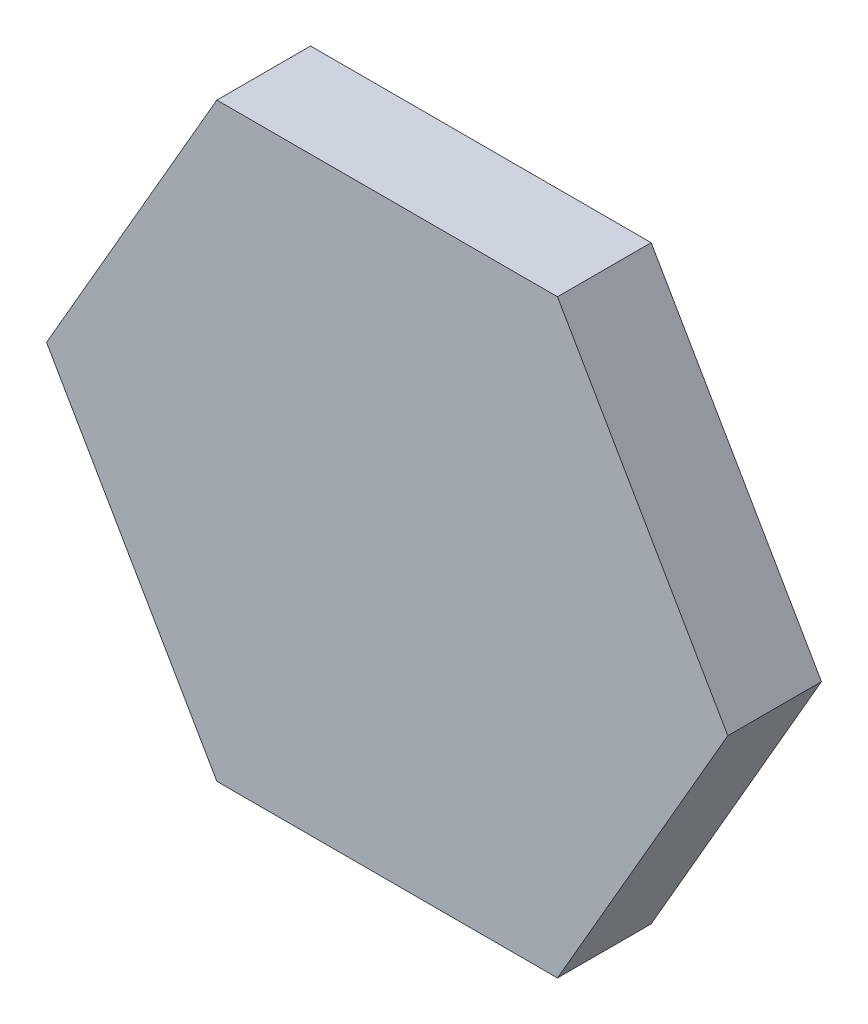
ISO-10303-21;
HEADER;
FILE_DESCRIPTION(('STEP AP214'),'2;1');
FILE_NAME('part.step','',(''),(''),'','','');
FILE_SCHEMA(('AUTOMOTIVE_DESIGN { 1 0 10303 214 1 1 1 1 }'));
ENDSEC;
DATA;
#1=APPLICATION_CONTEXT('core data for automotive mechanical design processes');
#2=APPLICATION_PROTOCOL_DEFINITION('international standard','automotive_design',2000,#1);
#3=PRODUCT_CONTEXT('',#1,'mechanical');
#4=PRODUCT('Part','Part','',(#3));
#5=PRODUCT_RELATED_PRODUCT_CATEGORY('part','',(#4));
#6=PRODUCT_DEFINITION_FORMATION('','',#4);
#7=PRODUCT_DEFINITION_CONTEXT('part definition',#1,'design');
#8=PRODUCT_DEFINITION('design','',#6,#7);
#9=PRODUCT_DEFINITION_SHAPE('','',#8);
#10=(LENGTH_UNIT() NAMED_UNIT(*) SI_UNIT(.MILLI.,.METRE.));
#11=(NAMED_UNIT(*) PLANE_ANGLE_UNIT() SI_UNIT($,.RADIAN.));
#12=(NAMED_UNIT(*) SI_UNIT($,.STERADIAN.) SOLID_ANGLE_UNIT());
#13=UNCERTAINTY_MEASURE_WITH_UNIT(LENGTH_MEASURE(1.E-05),#10,'distance_accuracy_value','');
#14=(GEOMETRIC_REPRESENTATION_CONTEXT(3) GLOBAL_UNCERTAINTY_ASSIGNED_CONTEXT((#13)) GLOBAL_UNIT_ASSIGNED_CONTEXT((#10,
#11,#12)) REPRESENTATION_CONTEXT('',''));
#15=CARTESIAN_POINT('',(0.,0.,0.));
#16=DIRECTION('',(0.,0.,1.));
#17=DIRECTION('',(1.,0.,0.));
#18=AXIS2_PLACEMENT_3D('',#15,#16,#17);
#19=CARTESIAN_POINT('',(-60.,0.,1.5));
#20=DIRECTION('',(0.866025403784439,0.5,0.));
#21=DIRECTION('',(-0.5,0.866025403784439,0.));
#22=AXIS2_PLACEMENT_3D('',#19,#20,#21);
#23=PLANE('',#22);
#24=DIRECTION('',(0.,0.,-1.));
#25=VECTOR('',#24,1.);
#26=CARTESIAN_POINT('',(-60.,0.,1.5));
#27=LINE('',#26,#25);
#28=CARTESIAN_POINT('',(-60.,0.,1.5));
#29=VERTEX_POINT('',#28);
#30=CARTESIAN_POINT('',(-60.,0.,-15.));
#31=VERTEX_POINT('',#30);
#32=EDGE_CURVE('E270',#29,#31,#27,.T.);
#33=ORIENTED_EDGE('',*,*,#32,.T.);
#34=DIRECTION('',(0.5,-0.866025403784439,0.));
#35=VECTOR('',#34,1.);
#36=CARTESIAN_POINT('',(-60.,0.,-15.));
#37=LINE('',#36,#35);
#38=CARTESIAN_POINT('',(-30.,-51.9615242270663,-15.));
#39=VERTEX_POINT('',#38);
#40=EDGE_CURVE('E249',#31,#39,#37,.T.);
#41=ORIENTED_EDGE('',*,*,#40,.T.);
#42=DIRECTION('',(0.,0.,-1.));
#43=VECTOR('',#42,1.);
#44=CARTESIAN_POINT('',(-30.,-51.9615242270663,1.5));
#45=LINE('',#44,#43);
#46=CARTESIAN_POINT('',(-30.,-51.9615242270663,1.5));
#47=VERTEX_POINT('',#46);
#48=EDGE_CURVE('E280',#47,#39,#45,.T.);
#49=ORIENTED_EDGE('',*,*,#48,.F.);
#50=DIRECTION('',(0.5,-0.866025403784438,0.));
#51=VECTOR('',#50,1.);
#52=CARTESIAN_POINT('',(-60.,0.,1.5));
#53=LINE('',#52,#51);
#54=EDGE_CURVE('E255',#29,#47,#53,.T.);
#55=ORIENTED_EDGE('',*,*,#54,.F.);
#56=EDGE_LOOP('',(#33,#41,#49,#55));
#57=FACE_BOUND('',#56,.T.);
#58=ADVANCED_FACE('F33',(#57),#23,.F.);
#59=CARTESIAN_POINT('',(-30.,-51.9615242270663,1.5));
#60=DIRECTION('',(0.,1.,0.));
#61=DIRECTION('',(0.,0.,1.));
#62=AXIS2_PLACEMENT_3D('',#59,#60,#61);
#63=PLANE('',#62);
#64=ORIENTED_EDGE('',*,*,#48,.T.);
#65=DIRECTION('',(1.,0.,0.));
#66=VECTOR('',#65,1.);
#67=CARTESIAN_POINT('',(30.,-51.9615242270663,-15.));
#68=LINE('',#67,#66);
#69=CARTESIAN_POINT('',(30.,-51.9615242270663,-15.));
#70=VERTEX_POINT('',#69);
#71=EDGE_CURVE('E244',#39,#70,#68,.T.);
#72=ORIENTED_EDGE('',*,*,#71,.T.);
#73=DIRECTION('',(0.,0.,-1.));
#74=VECTOR('',#73,1.);
#75=CARTESIAN_POINT('',(30.,-51.9615242270663,1.5));
#76=LINE('',#75,#74);
#77=CARTESIAN_POINT('',(30.,-51.9615242270663,1.5));
#78=VERTEX_POINT('',#77);
#79=EDGE_CURVE('E278',#78,#70,#76,.T.);
#80=ORIENTED_EDGE('',*,*,#79,.F.);
#81=DIRECTION('',(1.,0.,0.));
#82=VECTOR('',#81,1.);
#83=CARTESIAN_POINT('',(-30.,-51.9615242270663,1.5));
#84=LINE('',#83,#82);
#85=EDGE_CURVE('E260',#47,#78,#84,.T.);
#86=ORIENTED_EDGE('',*,*,#85,.F.);
#87=EDGE_LOOP('',(#64,#72,#80,#86));
#88=FACE_BOUND('',#87,.T.);
#89=ADVANCED_FACE('F328',(#88),#63,.F.);
#90=CARTESIAN_POINT('',(30.,-51.9615242270663,1.5));
#91=DIRECTION('',(-0.866025403784439,0.5,0.));
#92=DIRECTION('',(-0.5,-0.866025403784439,0.));
#93=AXIS2_PLACEMENT_3D('',#90,#91,#92);
#94=PLANE('',#93);
#95=ORIENTED_EDGE('',*,*,#79,.T.);
#96=DIRECTION('',(0.5,0.866025403784439,0.));
#97=VECTOR('',#96,1.);
#98=CARTESIAN_POINT('',(60.,0.,-15.));
#99=LINE('',#98,#97);
#100=CARTESIAN_POINT('',(60.,0.,-15.));
#101=VERTEX_POINT('',#100);
#102=EDGE_CURVE('E238',#70,#101,#99,.T.);
#103=ORIENTED_EDGE('',*,*,#102,.T.);
#104=DIRECTION('',(0.,0.,-1.));
#105=VECTOR('',#104,1.);
#106=CARTESIAN_POINT('',(60.,0.,1.5));
#107=LINE('',#106,#105);
#108=CARTESIAN_POINT('',(60.,0.,1.5));
#109=VERTEX_POINT('',#108);
#110=EDGE_CURVE('E276',#109,#101,#107,.T.);
#111=ORIENTED_EDGE('',*,*,#110,.F.);
#112=DIRECTION('',(0.5,0.866025403784439,0.));
#113=VECTOR('',#112,1.);
#114=CARTESIAN_POINT('',(30.,-51.9615242270663,1.5));
#115=LINE('',#114,#113);
#116=EDGE_CURVE('E262',#78,#109,#115,.T.);
#117=ORIENTED_EDGE('',*,*,#116,.F.);
#118=EDGE_LOOP('',(#95,#103,#111,#117));
#119=FACE_BOUND('',#118,.T.);
#120=ADVANCED_FACE('F334',(#119),#94,.F.);
#121=CARTESIAN_POINT('',(60.,0.,1.5));
#122=DIRECTION('',(-0.866025403784438,-0.5,0.));
#123=DIRECTION('',(0.5,-0.866025403784439,0.));
#124=AXIS2_PLACEMENT_3D('',#121,#122,#123);
#125=PLANE('',#124);
#126=ORIENTED_EDGE('',*,*,#110,.T.);
#127=DIRECTION('',(0.5,-0.866025403784439,0.));
#128=VECTOR('',#127,1.);
#129=CARTESIAN_POINT('',(60.,0.,-15.));
#130=LINE('',#129,#128);
#131=CARTESIAN_POINT('',(30.,51.9615242270663,-15.));
#132=VERTEX_POINT('',#131);
#133=EDGE_CURVE('E221',#132,#101,#130,.T.);
#134=ORIENTED_EDGE('',*,*,#133,.F.);
#135=DIRECTION('',(0.,0.,-1.));
#136=VECTOR('',#135,1.);
#137=CARTESIAN_POINT('',(30.,51.9615242270663,1.5));
#138=LINE('',#137,#136);
#139=CARTESIAN_POINT('',(30.,51.9615242270663,1.5));
#140=VERTEX_POINT('',#139);
#141=EDGE_CURVE('E274',#140,#132,#138,.T.);
#142=ORIENTED_EDGE('',*,*,#141,.F.);
#143=DIRECTION('',(-0.5,0.866025403784439,0.));
#144=VECTOR('',#143,1.);
#145=CARTESIAN_POINT('',(60.,0.,1.5));
#146=LINE('',#145,#144);
#147=EDGE_CURVE('E264',#109,#140,#146,.T.);
#148=ORIENTED_EDGE('',*,*,#147,.F.);
#149=EDGE_LOOP('',(#126,#134,#142,#148));
#150=FACE_BOUND('',#149,.T.);
#151=ADVANCED_FACE('F356',(#150),#125,.F.);
#152=CARTESIAN_POINT('',(30.,51.9615242270663,1.5));
#153=DIRECTION('',(0.,-1.,0.));
#154=DIRECTION('',(0.,0.,-1.));
#155=AXIS2_PLACEMENT_3D('',#152,#153,#154);
#156=PLANE('',#155);
#157=ORIENTED_EDGE('',*,*,#141,.T.);
#158=DIRECTION('',(1.,0.,0.));
#159=VECTOR('',#158,1.);
#160=CARTESIAN_POINT('',(30.,51.9615242270663,-15.));
#161=LINE('',#160,#159);
#162=CARTESIAN_POINT('',(-30.,51.9615242270663,-15.));
#163=VERTEX_POINT('',#162);
#164=EDGE_CURVE('E229',#163,#132,#161,.T.);
#165=ORIENTED_EDGE('',*,*,#164,.F.);
#166=DIRECTION('',(0.,0.,-1.));
#167=VECTOR('',#166,1.);
#168=CARTESIAN_POINT('',(-30.,51.9615242270663,1.5));
#169=LINE('',#168,#167);
#170=CARTESIAN_POINT('',(-30.,51.9615242270663,1.5));
#171=VERTEX_POINT('',#170);
#172=EDGE_CURVE('E272',#171,#163,#169,.T.);
#173=ORIENTED_EDGE('',*,*,#172,.F.);
#174=DIRECTION('',(-1.,0.,0.));
#175=VECTOR('',#174,1.);
#176=CARTESIAN_POINT('',(30.,51.9615242270663,1.5));
#177=LINE('',#176,#175);
#178=EDGE_CURVE('E266',#140,#171,#177,.T.);
#179=ORIENTED_EDGE('',*,*,#178,.F.);
#180=EDGE_LOOP('',(#157,#165,#173,#179));
#181=FACE_BOUND('',#180,.T.);
#182=ADVANCED_FACE('F352',(#181),#156,.F.);
#183=CARTESIAN_POINT('',(-30.,51.9615242270663,1.5));
#184=DIRECTION('',(0.866025403784439,-0.5,0.));
#185=DIRECTION('',(0.5,0.866025403784439,0.));
#186=AXIS2_PLACEMENT_3D('',#183,#184,#185);
#187=PLANE('',#186);
#188=ORIENTED_EDGE('',*,*,#172,.T.);
#189=DIRECTION('',(0.5,0.866025403784439,0.));
#190=VECTOR('',#189,1.);
#191=CARTESIAN_POINT('',(-60.,0.,-15.));
#192=LINE('',#191,#190);
#193=EDGE_CURVE('E233',#31,#163,#192,.T.);
#194=ORIENTED_EDGE('',*,*,#193,.F.);
#195=ORIENTED_EDGE('',*,*,#32,.F.);
#196=DIRECTION('',(-0.5,-0.866025403784439,0.));
#197=VECTOR('',#196,1.);
#198=CARTESIAN_POINT('',(-30.,51.9615242270663,1.5));
#199=LINE('',#198,#197);
#200=EDGE_CURVE('E268',#171,#29,#199,.T.);
#201=ORIENTED_EDGE('',*,*,#200,.F.);
#202=EDGE_LOOP('',(#188,#194,#195,#201));
#203=FACE_BOUND('',#202,.T.);
#204=ADVANCED_FACE('F348',(#203),#187,.F.);
#205=CARTESIAN_POINT('',(0.,0.,1.5));
#206=DIRECTION('',(0.,0.,1.));
#207=DIRECTION('',(1.,0.,0.));
#208=AXIS2_PLACEMENT_3D('',#205,#206,#207);
#209=PLANE('',#208);
#210=ORIENTED_EDGE('',*,*,#54,.T.);
#211=ORIENTED_EDGE('',*,*,#85,.T.);
#212=ORIENTED_EDGE('',*,*,#116,.T.);
#213=ORIENTED_EDGE('',*,*,#147,.T.);
#214=ORIENTED_EDGE('',*,*,#178,.T.);
#215=ORIENTED_EDGE('',*,*,#200,.T.);
#216=EDGE_LOOP('',(#210,#211,#212,#213,#214,#215));
#217=FACE_BOUND('',#216,.T.);
#218=ADVANCED_FACE('F363',(#217),#209,.T.);
#219=CARTESIAN_POINT('',(-58.7009618943234,0.749999999999979,-15.));
#220=DIRECTION('',(0.,0.,-1.));
#221=DIRECTION('',(0.,1.,0.));
#222=AXIS2_PLACEMENT_3D('',#219,#220,#221);
#223=PLANE('',#222);
#224=DIRECTION('',(0.5,-0.866025403784438,0.));
#225=VECTOR('',#224,1.);
#226=CARTESIAN_POINT('',(29.75,51.5285115251741,-15.));
#227=LINE('',#226,#225);
#228=CARTESIAN_POINT('',(29.75,51.5285115251741,-15.));
#229=VERTEX_POINT('',#228);
#230=CARTESIAN_POINT('',(59.5,0.,-15.));
#231=VERTEX_POINT('',#230);
#232=EDGE_CURVE('E47',#229,#231,#227,.T.);
#233=ORIENTED_EDGE('',*,*,#232,.F.);
#234=DIRECTION('',(1.,0.,0.));
#235=VECTOR('',#234,1.);
#236=CARTESIAN_POINT('',(-29.75,51.5285115251741,-15.));
#237=LINE('',#236,#235);
#238=CARTESIAN_POINT('',(-29.75,51.5285115251741,-15.));
#239=VERTEX_POINT('',#238);
#240=EDGE_CURVE('E177',#239,#229,#237,.T.);
#241=ORIENTED_EDGE('',*,*,#240,.F.);
#242=DIRECTION('',(0.499999999999999,0.866025403784439,0.));
#243=VECTOR('',#242,1.);
#244=CARTESIAN_POINT('',(-59.5,0.,-15.));
#245=LINE('',#244,#243);
#246=CARTESIAN_POINT('',(-59.5,0.,-15.));
#247=VERTEX_POINT('',#246);
#248=EDGE_CURVE('E180',#247,#239,#245,.T.);
#249=ORIENTED_EDGE('',*,*,#248,.F.);
#250=DIRECTION('',(-0.5,0.866025403784438,0.));
#251=VECTOR('',#250,1.);
#252=CARTESIAN_POINT('',(-29.75,-51.5285115251741,-15.));
#253=LINE('',#252,#251);
#254=CARTESIAN_POINT('',(-29.75,-51.5285115251741,-15.));
#255=VERTEX_POINT('',#254);
#256=EDGE_CURVE('E196',#255,#247,#253,.T.);
#257=ORIENTED_EDGE('',*,*,#256,.F.);
#258=DIRECTION('',(-1.,0.,0.));
#259=VECTOR('',#258,1.);
#260=CARTESIAN_POINT('',(29.75,-51.5285115251741,-15.));
#261=LINE('',#260,#259);
#262=CARTESIAN_POINT('',(29.75,-51.5285115251741,-15.));
#263=VERTEX_POINT('',#262);
#264=EDGE_CURVE('E193',#263,#255,#261,.T.);
#265=ORIENTED_EDGE('',*,*,#264,.F.);
#266=DIRECTION('',(-0.499999999999999,-0.866025403784439,0.));
#267=VECTOR('',#266,1.);
#268=CARTESIAN_POINT('',(59.5,0.,-15.));
#269=LINE('',#268,#267);
#270=EDGE_CURVE('E191',#231,#263,#269,.T.);
#271=ORIENTED_EDGE('',*,*,#270,.F.);
#272=EDGE_LOOP('',(#233,#241,#249,#257,#265,#271));
#273=FACE_BOUND('',#272,.T.);
#274=ORIENTED_EDGE('',*,*,#133,.T.);
#275=ORIENTED_EDGE('',*,*,#102,.F.);
#276=ORIENTED_EDGE('',*,*,#71,.F.);
#277=ORIENTED_EDGE('',*,*,#40,.F.);
#278=ORIENTED_EDGE('',*,*,#193,.T.);
#279=ORIENTED_EDGE('',*,*,#164,.T.);
#280=EDGE_LOOP('',(#274,#275,#276,#277,#278,#279));
#281=FACE_BOUND('',#280,.T.);
#282=ADVANCED_FACE('F345',(#273,#281),#223,.T.);
#283=CARTESIAN_POINT('',(0.,0.,-14.));
#284=DIRECTION('',(0.,0.,-1.));
#285=DIRECTION('',(0.,1.,0.));
#286=AXIS2_PLACEMENT_3D('',#283,#284,#285);
#287=PLANE('',#286);
#288=DIRECTION('',(0.5,-0.866025403784438,0.));
#289=VECTOR('',#288,1.);
#290=CARTESIAN_POINT('',(29.75,51.5285115251741,-14.));
#291=LINE('',#290,#289);
#292=CARTESIAN_POINT('',(29.75,51.5285115251741,-14.));
#293=VERTEX_POINT('',#292);
#294=CARTESIAN_POINT('',(59.5,0.,-14.));
#295=VERTEX_POINT('',#294);
#296=EDGE_CURVE('E158',#293,#295,#291,.T.);
#297=ORIENTED_EDGE('',*,*,#296,.T.);
#298=DIRECTION('',(-0.499999999999999,-0.866025403784439,0.));
#299=VECTOR('',#298,1.);
#300=CARTESIAN_POINT('',(59.5,0.,-14.));
#301=LINE('',#300,#299);
#302=CARTESIAN_POINT('',(29.75,-51.5285115251741,-14.));
#303=VERTEX_POINT('',#302);
#304=EDGE_CURVE('E167',#295,#303,#301,.T.);
#305=ORIENTED_EDGE('',*,*,#304,.T.);
#306=DIRECTION('',(-1.,0.,0.));
#307=VECTOR('',#306,1.);
#308=CARTESIAN_POINT('',(29.75,-51.5285115251741,-14.));
#309=LINE('',#308,#307);
#310=CARTESIAN_POINT('',(-29.75,-51.5285115251741,-14.));
#311=VERTEX_POINT('',#310);
#312=EDGE_CURVE('E172',#303,#311,#309,.T.);
#313=ORIENTED_EDGE('',*,*,#312,.T.);
#314=DIRECTION('',(-0.5,0.866025403784438,0.));
#315=VECTOR('',#314,1.);
#316=CARTESIAN_POINT('',(-29.75,-51.5285115251741,-14.));
#317=LINE('',#316,#315);
#318=CARTESIAN_POINT('',(-59.5,0.,-14.));
#319=VERTEX_POINT('',#318);
#320=EDGE_CURVE('E184',#311,#319,#317,.T.);
#321=ORIENTED_EDGE('',*,*,#320,.T.);
#322=DIRECTION('',(0.499999999999999,0.866025403784439,0.));
#323=VECTOR('',#322,1.);
#324=CARTESIAN_POINT('',(-59.5,0.,-14.));
#325=LINE('',#324,#323);
#326=CARTESIAN_POINT('',(-29.75,51.5285115251741,-14.));
#327=VERTEX_POINT('',#326);
#328=EDGE_CURVE('E187',#319,#327,#325,.T.);
#329=ORIENTED_EDGE('',*,*,#328,.T.);
#330=DIRECTION('',(1.,0.,0.));
#331=VECTOR('',#330,1.);
#332=CARTESIAN_POINT('',(-29.75,51.5285115251741,-14.));
#333=LINE('',#332,#331);
#334=EDGE_CURVE('E164',#327,#293,#333,.T.);
#335=ORIENTED_EDGE('',*,*,#334,.T.);
#336=EDGE_LOOP('',(#297,#305,#313,#321,#329,#335));
#337=FACE_BOUND('',#336,.T.);
#338=DIRECTION('',(0.5,-0.866025403784438,0.));
#339=VECTOR('',#338,1.);
#340=CARTESIAN_POINT('',(-43.7009618943234,-25.2307621135332,-14.));
#341=LINE('',#340,#339);
#342=CARTESIAN_POINT('',(-58.2679491924312,0.,-14.));
#343=VERTEX_POINT('',#342);
#344=CARTESIAN_POINT('',(-29.1339745962156,-50.4615242270663,-14.));
#345=VERTEX_POINT('',#344);
#346=EDGE_CURVE('E219',#343,#345,#341,.T.);
#347=ORIENTED_EDGE('',*,*,#346,.T.);
#348=DIRECTION('',(-1.,0.,0.));
#349=VECTOR('',#348,1.);
#350=CARTESIAN_POINT('',(0.,-50.4615242270663,-14.));
#351=LINE('',#350,#349);
#352=CARTESIAN_POINT('',(29.1339745962156,-50.4615242270663,-14.));
#353=VERTEX_POINT('',#352);
#354=EDGE_CURVE('E216',#353,#345,#351,.T.);
#355=ORIENTED_EDGE('',*,*,#354,.F.);
#356=DIRECTION('',(-0.5,-0.866025403784439,0.));
#357=VECTOR('',#356,1.);
#358=CARTESIAN_POINT('',(43.7009618943234,-25.2307621135331,-14.));
#359=LINE('',#358,#357);
#360=CARTESIAN_POINT('',(58.2679491924311,0.,-14.));
#361=VERTEX_POINT('',#360);
#362=EDGE_CURVE('E55',#361,#353,#359,.T.);
#363=ORIENTED_EDGE('',*,*,#362,.F.);
#364=DIRECTION('',(0.5,-0.866025403784439,0.));
#365=VECTOR('',#364,1.);
#366=CARTESIAN_POINT('',(43.7009618943234,25.2307621135331,-14.));
#367=LINE('',#366,#365);
#368=CARTESIAN_POINT('',(29.1339745962156,50.4615242270663,-14.));
#369=VERTEX_POINT('',#368);
#370=EDGE_CURVE('E11',#369,#361,#367,.T.);
#371=ORIENTED_EDGE('',*,*,#370,.F.);
#372=DIRECTION('',(1.,0.,0.));
#373=VECTOR('',#372,1.);
#374=CARTESIAN_POINT('',(0.,50.4615242270663,-14.));
#375=LINE('',#374,#373);
#376=CARTESIAN_POINT('',(-29.1339745962156,50.4615242270663,-14.));
#377=VERTEX_POINT('',#376);
#378=EDGE_CURVE('E203',#377,#369,#375,.T.);
#379=ORIENTED_EDGE('',*,*,#378,.F.);
#380=DIRECTION('',(-0.5,-0.866025403784438,0.));
#381=VECTOR('',#380,1.);
#382=CARTESIAN_POINT('',(-43.7009618943234,25.2307621135332,-14.));
#383=LINE('',#382,#381);
#384=EDGE_CURVE('E213',#377,#343,#383,.T.);
#385=ORIENTED_EDGE('',*,*,#384,.T.);
#386=EDGE_LOOP('',(#347,#355,#363,#371,#379,#385));
#387=FACE_BOUND('',#386,.T.);
#388=ADVANCED_FACE('F174',(#337,#387),#287,.T.);
#389=CARTESIAN_POINT('',(29.75,51.5285115251741,-14.));
#390=DIRECTION('',(0.866025403784438,0.5,0.));
#391=DIRECTION('',(-0.5,0.866025403784439,0.));
#392=AXIS2_PLACEMENT_3D('',#389,#390,#391);
#393=PLANE('',#392);
#394=ORIENTED_EDGE('',*,*,#232,.T.);
#395=DIRECTION('',(0.,0.,-1.));
#396=VECTOR('',#395,1.);
#397=CARTESIAN_POINT('',(59.5,0.,-14.));
#398=LINE('',#397,#396);
#399=EDGE_CURVE('E154',#295,#231,#398,.T.);
#400=ORIENTED_EDGE('',*,*,#399,.F.);
#401=ORIENTED_EDGE('',*,*,#296,.F.);
#402=DIRECTION('',(0.,0.,-1.));
#403=VECTOR('',#402,1.);
#404=CARTESIAN_POINT('',(29.75,51.5285115251741,-14.));
#405=LINE('',#404,#403);
#406=EDGE_CURVE('E201',#293,#229,#405,.T.);
#407=ORIENTED_EDGE('',*,*,#406,.T.);
#408=EDGE_LOOP('',(#394,#400,#401,#407));
#409=FACE_BOUND('',#408,.T.);
#410=ADVANCED_FACE('F156',(#409),#393,.F.);
#411=CARTESIAN_POINT('',(-29.75,51.5285115251741,-14.));
#412=DIRECTION('',(0.,1.,0.));
#413=DIRECTION('',(-1.,0.,0.));
#414=AXIS2_PLACEMENT_3D('',#411,#412,#413);
#415=PLANE('',#414);
#416=ORIENTED_EDGE('',*,*,#240,.T.);
#417=ORIENTED_EDGE('',*,*,#406,.F.);
#418=ORIENTED_EDGE('',*,*,#334,.F.);
#419=DIRECTION('',(0.,0.,-1.));
#420=VECTOR('',#419,1.);
#421=CARTESIAN_POINT('',(-29.75,51.5285115251741,-14.));
#422=LINE('',#421,#420);
#423=EDGE_CURVE('E204',#327,#239,#422,.T.);
#424=ORIENTED_EDGE('',*,*,#423,.T.);
#425=EDGE_LOOP('',(#416,#417,#418,#424));
#426=FACE_BOUND('',#425,.T.);
#427=ADVANCED_FACE('F424',(#426),#415,.F.);
#428=CARTESIAN_POINT('',(-59.5,0.,-14.));
#429=DIRECTION('',(-0.866025403784439,0.499999999999999,0.));
#430=DIRECTION('',(-0.499999999999999,-0.866025403784439,0.));
#431=AXIS2_PLACEMENT_3D('',#428,#429,#430);
#432=PLANE('',#431);
#433=ORIENTED_EDGE('',*,*,#248,.T.);
#434=ORIENTED_EDGE('',*,*,#423,.F.);
#435=ORIENTED_EDGE('',*,*,#328,.F.);
#436=DIRECTION('',(0.,0.,-1.));
#437=VECTOR('',#436,1.);
#438=CARTESIAN_POINT('',(-59.5,0.,-14.));
#439=LINE('',#438,#437);
#440=EDGE_CURVE('E206',#319,#247,#439,.T.);
#441=ORIENTED_EDGE('',*,*,#440,.T.);
#442=EDGE_LOOP('',(#433,#434,#435,#441));
#443=FACE_BOUND('',#442,.T.);
#444=ADVANCED_FACE('F433',(#443),#432,.F.);
#445=CARTESIAN_POINT('',(-29.75,-51.5285115251741,-14.));
#446=DIRECTION('',(-0.866025403784438,-0.5,0.));
#447=DIRECTION('',(0.5,-0.866025403784439,0.));
#448=AXIS2_PLACEMENT_3D('',#445,#446,#447);
#449=PLANE('',#448);
#450=ORIENTED_EDGE('',*,*,#256,.T.);
#451=ORIENTED_EDGE('',*,*,#440,.F.);
#452=ORIENTED_EDGE('',*,*,#320,.F.);
#453=DIRECTION('',(0.,0.,-1.));
#454=VECTOR('',#453,1.);
#455=CARTESIAN_POINT('',(-29.75,-51.5285115251741,-14.));
#456=LINE('',#455,#454);
#457=EDGE_CURVE('E208',#311,#255,#456,.T.);
#458=ORIENTED_EDGE('',*,*,#457,.T.);
#459=EDGE_LOOP('',(#450,#451,#452,#458));
#460=FACE_BOUND('',#459,.T.);
#461=ADVANCED_FACE('F443',(#460),#449,.F.);
#462=CARTESIAN_POINT('',(29.75,-51.5285115251741,-14.));
#463=DIRECTION('',(0.,-1.,0.));
#464=DIRECTION('',(1.,0.,0.));
#465=AXIS2_PLACEMENT_3D('',#462,#463,#464);
#466=PLANE('',#465);
#467=ORIENTED_EDGE('',*,*,#264,.T.);
#468=ORIENTED_EDGE('',*,*,#457,.F.);
#469=ORIENTED_EDGE('',*,*,#312,.F.);
#470=DIRECTION('',(0.,0.,-1.));
#471=VECTOR('',#470,1.);
#472=CARTESIAN_POINT('',(29.75,-51.5285115251741,-14.));
#473=LINE('',#472,#471);
#474=EDGE_CURVE('E163',#303,#263,#473,.T.);
#475=ORIENTED_EDGE('',*,*,#474,.T.);
#476=EDGE_LOOP('',(#467,#468,#469,#475));
#477=FACE_BOUND('',#476,.T.);
#478=ADVANCED_FACE('F453',(#477),#466,.F.);
#479=CARTESIAN_POINT('',(59.5,0.,-14.));
#480=DIRECTION('',(0.866025403784439,-0.5,0.));
#481=DIRECTION('',(0.499999999999999,0.866025403784439,0.));
#482=AXIS2_PLACEMENT_3D('',#479,#480,#481);
#483=PLANE('',#482);
#484=ORIENTED_EDGE('',*,*,#270,.T.);
#485=ORIENTED_EDGE('',*,*,#474,.F.);
#486=ORIENTED_EDGE('',*,*,#304,.F.);
#487=ORIENTED_EDGE('',*,*,#399,.T.);
#488=EDGE_LOOP('',(#484,#485,#486,#487));
#489=FACE_BOUND('',#488,.T.);
#490=ADVANCED_FACE('F168',(#489),#483,.F.);
#491=CARTESIAN_POINT('',(0.,0.,0.));
#492=DIRECTION('',(0.,0.,1.));
#493=DIRECTION('',(1.,0.,0.));
#494=AXIS2_PLACEMENT_3D('',#491,#492,#493);
#495=PLANE('',#494);
#496=DIRECTION('',(-1.,0.,0.));
#497=VECTOR('',#496,1.);
#498=CARTESIAN_POINT('',(-30.,50.4615242270663,0.));
#499=LINE('',#498,#497);
#500=CARTESIAN_POINT('',(29.1339745962156,50.4615242270663,0.));
#501=VERTEX_POINT('',#500);
#502=CARTESIAN_POINT('',(-29.1339745962156,50.4615242270663,0.));
#503=VERTEX_POINT('',#502);
#504=EDGE_CURVE('E230',#501,#503,#499,.T.);
#505=ORIENTED_EDGE('',*,*,#504,.F.);
#506=DIRECTION('',(-0.5,0.866025403784439,0.));
#507=VECTOR('',#506,1.);
#508=CARTESIAN_POINT('',(28.7009618943233,51.2115242270663,0.));
#509=LINE('',#508,#507);
#510=CARTESIAN_POINT('',(58.2679491924311,0.,0.));
#511=VERTEX_POINT('',#510);
#512=EDGE_CURVE('E222',#511,#501,#509,.T.);
#513=ORIENTED_EDGE('',*,*,#512,.F.);
#514=DIRECTION('',(-0.5,-0.866025403784439,0.));
#515=VECTOR('',#514,1.);
#516=CARTESIAN_POINT('',(28.7009618943233,-51.2115242270663,0.));
#517=LINE('',#516,#515);
#518=CARTESIAN_POINT('',(29.1339745962156,-50.4615242270663,0.));
#519=VERTEX_POINT('',#518);
#520=EDGE_CURVE('E241',#511,#519,#517,.T.);
#521=ORIENTED_EDGE('',*,*,#520,.T.);
#522=DIRECTION('',(-1.,0.,0.));
#523=VECTOR('',#522,1.);
#524=CARTESIAN_POINT('',(-30.,-50.4615242270663,0.));
#525=LINE('',#524,#523);
#526=CARTESIAN_POINT('',(-29.1339745962156,-50.4615242270663,0.));
#527=VERTEX_POINT('',#526);
#528=EDGE_CURVE('E247',#519,#527,#525,.T.);
#529=ORIENTED_EDGE('',*,*,#528,.T.);
#530=DIRECTION('',(-0.5,0.866025403784438,0.));
#531=VECTOR('',#530,1.);
#532=CARTESIAN_POINT('',(-28.7009618943233,-51.2115242270663,0.));
#533=LINE('',#532,#531);
#534=CARTESIAN_POINT('',(-58.2679491924311,0.,0.));
#535=VERTEX_POINT('',#534);
#536=EDGE_CURVE('E252',#527,#535,#533,.T.);
#537=ORIENTED_EDGE('',*,*,#536,.T.);
#538=DIRECTION('',(-0.5,-0.866025403784438,0.));
#539=VECTOR('',#538,1.);
#540=CARTESIAN_POINT('',(-28.7009618943233,51.2115242270663,0.));
#541=LINE('',#540,#539);
#542=EDGE_CURVE('E236',#503,#535,#541,.T.);
#543=ORIENTED_EDGE('',*,*,#542,.F.);
#544=EDGE_LOOP('',(#505,#513,#521,#529,#537,#543));
#545=FACE_BOUND('',#544,.T.);
#546=ADVANCED_FACE('F302',(#545),#495,.F.);
#547=CARTESIAN_POINT('',(43.7009618943234,25.2307621135331,0.));
#548=DIRECTION('',(-0.866025403784439,-0.5,0.));
#549=DIRECTION('',(-0.5,0.866025403784439,0.));
#550=AXIS2_PLACEMENT_3D('',#547,#548,#549);
#551=PLANE('',#550);
#552=DIRECTION('',(0.,0.,-1.));
#553=VECTOR('',#552,1.);
#554=CARTESIAN_POINT('',(29.1339745962156,50.4615242270663,0.));
#555=LINE('',#554,#553);
#556=EDGE_CURVE('E40',#501,#369,#555,.T.);
#557=ORIENTED_EDGE('',*,*,#556,.T.);
#558=ORIENTED_EDGE('',*,*,#370,.T.);
#559=DIRECTION('',(0.,0.,1.));
#560=VECTOR('',#559,1.);
#561=CARTESIAN_POINT('',(58.2679491924311,0.,0.));
#562=LINE('',#561,#560);
#563=EDGE_CURVE('E225',#361,#511,#562,.T.);
#564=ORIENTED_EDGE('',*,*,#563,.T.);
#565=ORIENTED_EDGE('',*,*,#512,.T.);
#566=EDGE_LOOP('',(#557,#558,#564,#565));
#567=FACE_BOUND('',#566,.T.);
#568=ADVANCED_FACE('F293',(#567),#551,.T.);
#569=CARTESIAN_POINT('',(0.,50.4615242270663,0.));
#570=DIRECTION('',(0.,-1.,0.));
#571=DIRECTION('',(0.,0.,1.));
#572=AXIS2_PLACEMENT_3D('',#569,#570,#571);
#573=PLANE('',#572);
#574=DIRECTION('',(0.,0.,1.));
#575=VECTOR('',#574,1.);
#576=CARTESIAN_POINT('',(-29.1339745962156,50.4615242270663,0.));
#577=LINE('',#576,#575);
#578=EDGE_CURVE('E290',#377,#503,#577,.T.);
#579=ORIENTED_EDGE('',*,*,#578,.F.);
#580=ORIENTED_EDGE('',*,*,#378,.T.);
#581=ORIENTED_EDGE('',*,*,#556,.F.);
#582=ORIENTED_EDGE('',*,*,#504,.T.);
#583=EDGE_LOOP('',(#579,#580,#581,#582));
#584=FACE_BOUND('',#583,.T.);
#585=ADVANCED_FACE('F299',(#584),#573,.T.);
#586=CARTESIAN_POINT('',(-43.7009618943234,25.2307621135332,0.));
#587=DIRECTION('',(-0.866025403784439,0.5,0.));
#588=DIRECTION('',(0.5,0.866025403784438,0.));
#589=AXIS2_PLACEMENT_3D('',#586,#587,#588);
#590=PLANE('',#589);
#591=ORIENTED_EDGE('',*,*,#384,.F.);
#592=ORIENTED_EDGE('',*,*,#578,.T.);
#593=ORIENTED_EDGE('',*,*,#542,.T.);
#594=DIRECTION('',(0.,0.,-1.));
#595=VECTOR('',#594,1.);
#596=CARTESIAN_POINT('',(-58.2679491924312,0.,0.));
#597=LINE('',#596,#595);
#598=EDGE_CURVE('E287',#535,#343,#597,.T.);
#599=ORIENTED_EDGE('',*,*,#598,.T.);
#600=EDGE_LOOP('',(#591,#592,#593,#599));
#601=FACE_BOUND('',#600,.T.);
#602=ADVANCED_FACE('F308',(#601),#590,.F.);
#603=CARTESIAN_POINT('',(43.7009618943234,-25.2307621135331,0.));
#604=DIRECTION('',(-0.866025403784439,0.5,0.));
#605=DIRECTION('',(-0.5,-0.866025403784439,0.));
#606=AXIS2_PLACEMENT_3D('',#603,#604,#605);
#607=PLANE('',#606);
#608=ORIENTED_EDGE('',*,*,#563,.F.);
#609=ORIENTED_EDGE('',*,*,#362,.T.);
#610=DIRECTION('',(0.,0.,1.));
#611=VECTOR('',#610,1.);
#612=CARTESIAN_POINT('',(29.1339745962156,-50.4615242270663,0.));
#613=LINE('',#612,#611);
#614=EDGE_CURVE('E285',#353,#519,#613,.T.);
#615=ORIENTED_EDGE('',*,*,#614,.T.);
#616=ORIENTED_EDGE('',*,*,#520,.F.);
#617=EDGE_LOOP('',(#608,#609,#615,#616));
#618=FACE_BOUND('',#617,.T.);
#619=ADVANCED_FACE('F318',(#618),#607,.T.);
#620=CARTESIAN_POINT('',(0.,-50.4615242270663,0.));
#621=DIRECTION('',(0.,1.,0.));
#622=DIRECTION('',(0.,0.,1.));
#623=AXIS2_PLACEMENT_3D('',#620,#621,#622);
#624=PLANE('',#623);
#625=ORIENTED_EDGE('',*,*,#614,.F.);
#626=ORIENTED_EDGE('',*,*,#354,.T.);
#627=DIRECTION('',(0.,0.,-1.));
#628=VECTOR('',#627,1.);
#629=CARTESIAN_POINT('',(-29.1339745962156,-50.4615242270663,0.));
#630=LINE('',#629,#628);
#631=EDGE_CURVE('E282',#527,#345,#630,.T.);
#632=ORIENTED_EDGE('',*,*,#631,.F.);
#633=ORIENTED_EDGE('',*,*,#528,.F.);
#634=EDGE_LOOP('',(#625,#626,#632,#633));
#635=FACE_BOUND('',#634,.T.);
#636=ADVANCED_FACE('F315',(#635),#624,.T.);
#637=CARTESIAN_POINT('',(-43.7009618943234,-25.2307621135332,0.));
#638=DIRECTION('',(-0.866025403784439,-0.5,0.));
#639=DIRECTION('',(0.5,-0.866025403784438,0.));
#640=AXIS2_PLACEMENT_3D('',#637,#638,#639);
#641=PLANE('',#640);
#642=ORIENTED_EDGE('',*,*,#346,.F.);
#643=ORIENTED_EDGE('',*,*,#598,.F.);
#644=ORIENTED_EDGE('',*,*,#536,.F.);
#645=ORIENTED_EDGE('',*,*,#631,.T.);
#646=EDGE_LOOP('',(#642,#643,#644,#645));
#647=FACE_BOUND('',#646,.T.);
#648=ADVANCED_FACE('F311',(#647),#641,.F.);
#649=CLOSED_SHELL('',(#58,#89,#120,#151,#182,#204,#218,#282,#388,#410,#427,#444,#461,#478,#490,
#546,#568,#585,#602,#619,#636,#648));
#650=MANIFOLD_SOLID_BREP('B2',#649);
#651=ADVANCED_BREP_SHAPE_REPRESENTATION('',(#18,#650),#14);
#652=SHAPE_DEFINITION_REPRESENTATION(#9,#651);
ENDSEC;
END-ISO-10303-21;
